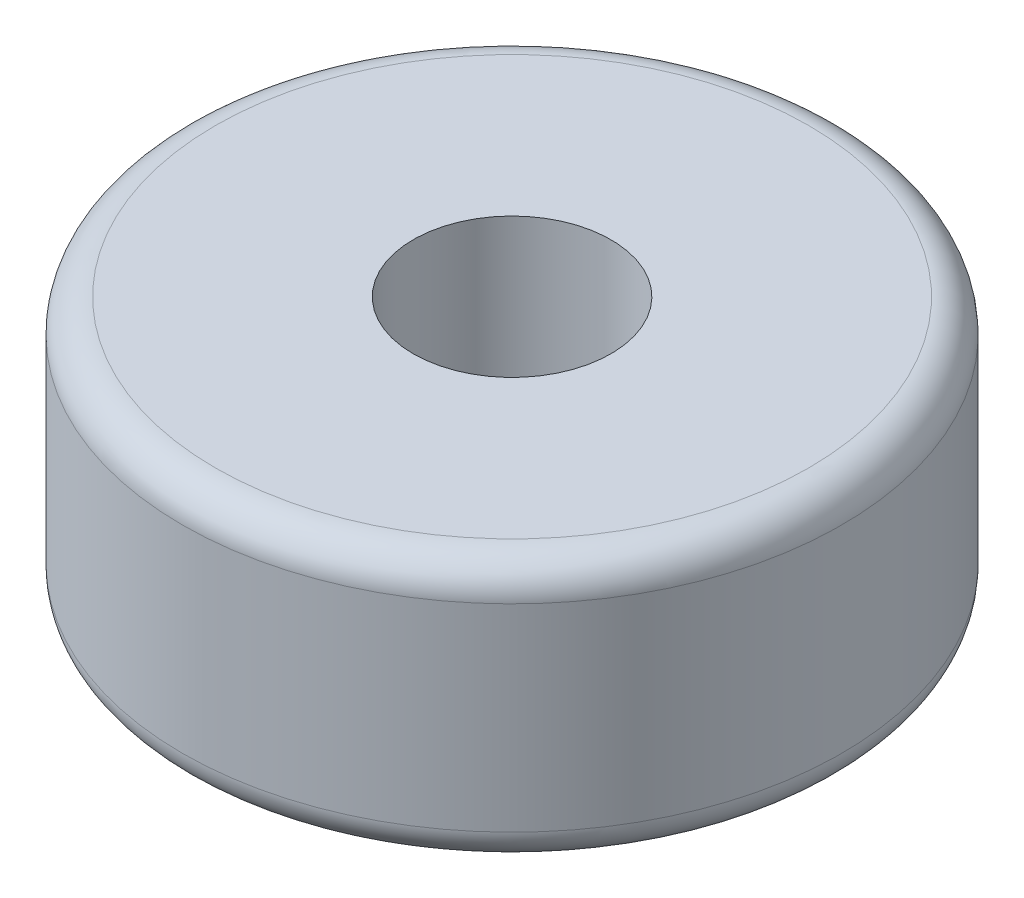
ISO-10303-21;
HEADER;
FILE_DESCRIPTION(('STEP AP214'),'2;1');
FILE_NAME('part.step','',(''),(''),'','','');
FILE_SCHEMA(('AUTOMOTIVE_DESIGN { 1 0 10303 214 1 1 1 1 }'));
ENDSEC;
DATA;
#1=APPLICATION_CONTEXT('core data for automotive mechanical design processes');
#2=APPLICATION_PROTOCOL_DEFINITION('international standard','automotive_design',2000,#1);
#3=PRODUCT_CONTEXT('',#1,'mechanical');
#4=PRODUCT('Part','Part','',(#3));
#5=PRODUCT_RELATED_PRODUCT_CATEGORY('part','',(#4));
#6=PRODUCT_DEFINITION_FORMATION('','',#4);
#7=PRODUCT_DEFINITION_CONTEXT('part definition',#1,'design');
#8=PRODUCT_DEFINITION('design','',#6,#7);
#9=PRODUCT_DEFINITION_SHAPE('','',#8);
#10=(LENGTH_UNIT() NAMED_UNIT(*) SI_UNIT(.MILLI.,.METRE.));
#11=(NAMED_UNIT(*) PLANE_ANGLE_UNIT() SI_UNIT($,.RADIAN.));
#12=(NAMED_UNIT(*) SI_UNIT($,.STERADIAN.) SOLID_ANGLE_UNIT());
#13=UNCERTAINTY_MEASURE_WITH_UNIT(LENGTH_MEASURE(1.E-05),#10,'distance_accuracy_value','');
#14=(GEOMETRIC_REPRESENTATION_CONTEXT(3) GLOBAL_UNCERTAINTY_ASSIGNED_CONTEXT((#13)) GLOBAL_UNIT_ASSIGNED_CONTEXT((#10,
#11,#12)) REPRESENTATION_CONTEXT('',''));
#15=CARTESIAN_POINT('',(0.,0.,0.));
#16=DIRECTION('',(0.,0.,1.));
#17=DIRECTION('',(1.,0.,0.));
#18=AXIS2_PLACEMENT_3D('',#15,#16,#17);
#19=CARTESIAN_POINT('',(0.,8.,0.));
#20=DIRECTION('',(0.,1.,0.));
#21=DIRECTION('',(0.,0.,1.));
#22=AXIS2_PLACEMENT_3D('',#19,#20,#21);
#23=PLANE('',#22);
#24=CARTESIAN_POINT('',(0.,8.,0.));
#25=DIRECTION('',(0.,1.,0.));
#26=DIRECTION('',(0.,0.,1.));
#27=AXIS2_PLACEMENT_3D('',#24,#25,#26);
#28=CIRCLE('',#27,9.);
#29=CARTESIAN_POINT('',(0.,8.,9.));
#30=VERTEX_POINT('',#29);
#31=EDGE_CURVE('E10',#30,#30,#28,.T.);
#32=ORIENTED_EDGE('',*,*,#31,.T.);
#33=EDGE_LOOP('',(#32));
#34=FACE_BOUND('',#33,.T.);
#35=CARTESIAN_POINT('',(0.,8.,0.));
#36=DIRECTION('',(0.,1.,0.));
#37=DIRECTION('',(0.,0.,1.));
#38=AXIS2_PLACEMENT_3D('',#35,#36,#37);
#39=CIRCLE('',#38,3.);
#40=CARTESIAN_POINT('',(0.,8.,3.));
#41=VERTEX_POINT('',#40);
#42=EDGE_CURVE('E52',#41,#41,#39,.T.);
#43=ORIENTED_EDGE('',*,*,#42,.F.);
#44=EDGE_LOOP('',(#43));
#45=FACE_BOUND('',#44,.T.);
#46=ADVANCED_FACE('F32',(#34,#45),#23,.T.);
#47=CARTESIAN_POINT('',(0.,0.,0.));
#48=DIRECTION('',(0.,1.,0.));
#49=DIRECTION('',(0.,0.,1.));
#50=AXIS2_PLACEMENT_3D('',#47,#48,#49);
#51=PLANE('',#50);
#52=CARTESIAN_POINT('',(0.,0.,0.));
#53=DIRECTION('',(0.,1.,0.));
#54=DIRECTION('',(0.,0.,1.));
#55=AXIS2_PLACEMENT_3D('',#52,#53,#54);
#56=CIRCLE('',#55,9.);
#57=CARTESIAN_POINT('',(0.,0.,9.));
#58=VERTEX_POINT('',#57);
#59=EDGE_CURVE('E39',#58,#58,#56,.F.);
#60=ORIENTED_EDGE('',*,*,#59,.T.);
#61=EDGE_LOOP('',(#60));
#62=FACE_BOUND('',#61,.T.);
#63=CARTESIAN_POINT('',(0.,0.,0.));
#64=DIRECTION('',(0.,1.,0.));
#65=DIRECTION('',(0.,0.,1.));
#66=AXIS2_PLACEMENT_3D('',#63,#64,#65);
#67=CIRCLE('',#66,3.);
#68=CARTESIAN_POINT('',(0.,0.,3.));
#69=VERTEX_POINT('',#68);
#70=EDGE_CURVE('E53',#69,#69,#67,.T.);
#71=ORIENTED_EDGE('',*,*,#70,.T.);
#72=EDGE_LOOP('',(#71));
#73=FACE_BOUND('',#72,.T.);
#74=ADVANCED_FACE('F63',(#62,#73),#51,.F.);
#75=CARTESIAN_POINT('',(0.,8.,0.));
#76=DIRECTION('',(0.,-1.,0.));
#77=DIRECTION('',(0.,0.,-1.));
#78=AXIS2_PLACEMENT_3D('',#75,#76,#77);
#79=CYLINDRICAL_SURFACE('',#78,10.);
#80=CARTESIAN_POINT('',(0.,1.,0.));
#81=DIRECTION('',(0.,1.,0.));
#82=DIRECTION('',(0.,0.,1.));
#83=AXIS2_PLACEMENT_3D('',#80,#81,#82);
#84=CIRCLE('',#83,10.);
#85=CARTESIAN_POINT('',(0.,1.,10.));
#86=VERTEX_POINT('',#85);
#87=EDGE_CURVE('E43',#86,#86,#84,.T.);
#88=ORIENTED_EDGE('',*,*,#87,.T.);
#89=EDGE_LOOP('',(#88));
#90=FACE_BOUND('',#89,.T.);
#91=CARTESIAN_POINT('',(0.,7.,0.));
#92=DIRECTION('',(0.,1.,0.));
#93=DIRECTION('',(0.,0.,1.));
#94=AXIS2_PLACEMENT_3D('',#91,#92,#93);
#95=CIRCLE('',#94,10.);
#96=CARTESIAN_POINT('',(0.,7.,10.));
#97=VERTEX_POINT('',#96);
#98=EDGE_CURVE('E47',#97,#97,#95,.F.);
#99=ORIENTED_EDGE('',*,*,#98,.T.);
#100=EDGE_LOOP('',(#99));
#101=FACE_BOUND('',#100,.T.);
#102=ADVANCED_FACE('F68',(#90,#101),#79,.T.);
#103=CARTESIAN_POINT('',(0.,8.,0.));
#104=DIRECTION('',(0.,-1.,0.));
#105=DIRECTION('',(0.,0.,-1.));
#106=AXIS2_PLACEMENT_3D('',#103,#104,#105);
#107=CYLINDRICAL_SURFACE('',#106,3.);
#108=ORIENTED_EDGE('',*,*,#42,.T.);
#109=EDGE_LOOP('',(#108));
#110=FACE_BOUND('',#109,.T.);
#111=ORIENTED_EDGE('',*,*,#70,.F.);
#112=EDGE_LOOP('',(#111));
#113=FACE_BOUND('',#112,.T.);
#114=ADVANCED_FACE('F59',(#110,#113),#107,.F.);
#115=CARTESIAN_POINT('',(0.,1.,0.));
#116=DIRECTION('',(0.,1.,0.));
#117=DIRECTION('',(0.,0.,1.));
#118=AXIS2_PLACEMENT_3D('',#115,#116,#117);
#119=TOROIDAL_SURFACE('',#118,9.,1.);
#120=ORIENTED_EDGE('',*,*,#59,.F.);
#121=EDGE_LOOP('',(#120));
#122=FACE_BOUND('',#121,.T.);
#123=ORIENTED_EDGE('',*,*,#87,.F.);
#124=EDGE_LOOP('',(#123));
#125=FACE_BOUND('',#124,.T.);
#126=ADVANCED_FACE('F74',(#122,#125),#119,.T.);
#127=CARTESIAN_POINT('',(0.,7.,0.));
#128=DIRECTION('',(0.,1.,0.));
#129=DIRECTION('',(0.,0.,1.));
#130=AXIS2_PLACEMENT_3D('',#127,#128,#129);
#131=TOROIDAL_SURFACE('',#130,9.,1.);
#132=ORIENTED_EDGE('',*,*,#98,.F.);
#133=EDGE_LOOP('',(#132));
#134=FACE_BOUND('',#133,.T.);
#135=ORIENTED_EDGE('',*,*,#31,.F.);
#136=EDGE_LOOP('',(#135));
#137=FACE_BOUND('',#136,.T.);
#138=ADVANCED_FACE('F34',(#134,#137),#131,.T.);
#139=CLOSED_SHELL('',(#46,#74,#102,#114,#126,#138));
#140=MANIFOLD_SOLID_BREP('B2',#139);
#141=ADVANCED_BREP_SHAPE_REPRESENTATION('',(#18,#140),#14);
#142=SHAPE_DEFINITION_REPRESENTATION(#9,#141);
ENDSEC;
END-ISO-10303-21;
